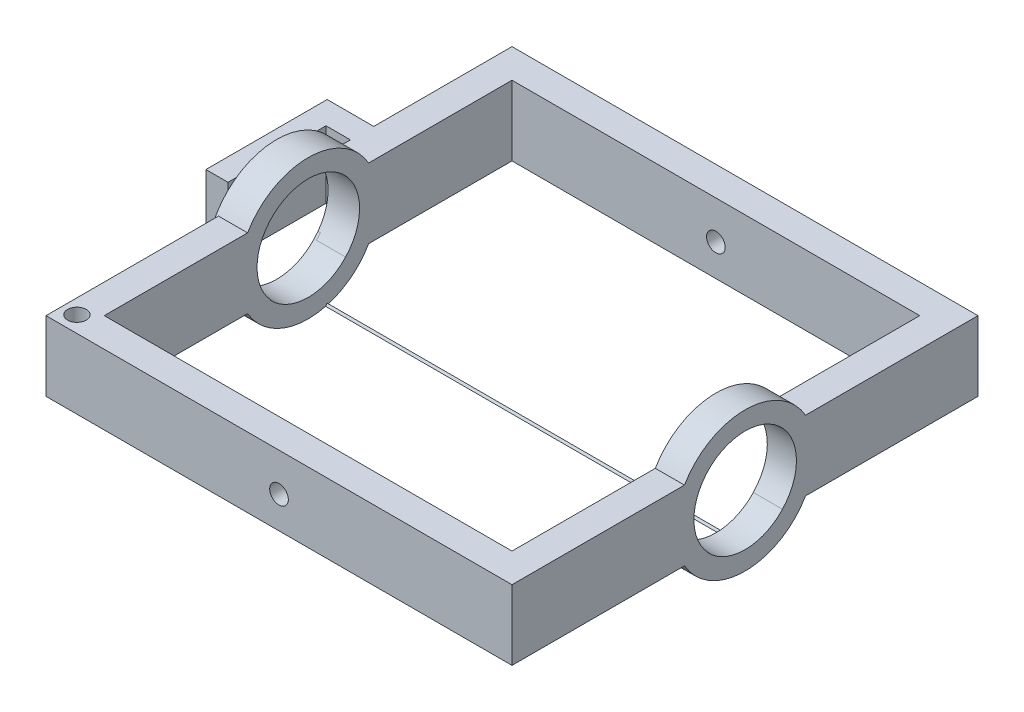
ISO-10303-21;
HEADER;
FILE_DESCRIPTION(('STEP AP214'),'2;1');
FILE_NAME('part.step','',(''),(''),'','','');
FILE_SCHEMA(('AUTOMOTIVE_DESIGN { 1 0 10303 214 1 1 1 1 }'));
ENDSEC;
DATA;
#1=APPLICATION_CONTEXT('core data for automotive mechanical design processes');
#2=APPLICATION_PROTOCOL_DEFINITION('international standard','automotive_design',2000,#1);
#3=PRODUCT_CONTEXT('',#1,'mechanical');
#4=PRODUCT('Part','Part','',(#3));
#5=PRODUCT_RELATED_PRODUCT_CATEGORY('part','',(#4));
#6=PRODUCT_DEFINITION_FORMATION('','',#4);
#7=PRODUCT_DEFINITION_CONTEXT('part definition',#1,'design');
#8=PRODUCT_DEFINITION('design','',#6,#7);
#9=PRODUCT_DEFINITION_SHAPE('','',#8);
#10=(LENGTH_UNIT() NAMED_UNIT(*) SI_UNIT(.MILLI.,.METRE.));
#11=(NAMED_UNIT(*) PLANE_ANGLE_UNIT() SI_UNIT($,.RADIAN.));
#12=(NAMED_UNIT(*) SI_UNIT($,.STERADIAN.) SOLID_ANGLE_UNIT());
#13=UNCERTAINTY_MEASURE_WITH_UNIT(LENGTH_MEASURE(1.E-05),#10,'distance_accuracy_value','');
#14=(GEOMETRIC_REPRESENTATION_CONTEXT(3) GLOBAL_UNCERTAINTY_ASSIGNED_CONTEXT((#13)) GLOBAL_UNIT_ASSIGNED_CONTEXT((#10,
#11,#12)) REPRESENTATION_CONTEXT('',''));
#15=CARTESIAN_POINT('',(0.,0.,0.));
#16=DIRECTION('',(0.,0.,1.));
#17=DIRECTION('',(1.,0.,0.));
#18=AXIS2_PLACEMENT_3D('',#15,#16,#17);
#19=CARTESIAN_POINT('',(-101.,15.,0.));
#20=DIRECTION('',(1.,0.,0.));
#21=DIRECTION('',(0.,0.,-1.));
#22=AXIS2_PLACEMENT_3D('',#19,#20,#21);
#23=CYLINDRICAL_SURFACE('',#22,30.);
#24=DIRECTION('',(1.,0.,0.));
#25=VECTOR('',#24,1.);
#26=CARTESIAN_POINT('',(-101.,30.,-25.9807621135332));
#27=LINE('',#26,#25);
#28=CARTESIAN_POINT('',(100.,30.,-25.9807621135332));
#29=VERTEX_POINT('',#28);
#30=CARTESIAN_POINT('',(87.5000000000002,30.,-25.9807621135332));
#31=VERTEX_POINT('',#30);
#32=EDGE_CURVE('E416',#29,#31,#27,.F.);
#33=ORIENTED_EDGE('',*,*,#32,.T.);
#34=CARTESIAN_POINT('',(87.5000000000002,15.,0.));
#35=DIRECTION('',(1.,0.,0.));
#36=DIRECTION('',(0.,0.,-1.));
#37=AXIS2_PLACEMENT_3D('',#34,#35,#36);
#38=CIRCLE('',#37,30.);
#39=CARTESIAN_POINT('',(87.5000000000002,30.,25.9807621135332));
#40=VERTEX_POINT('',#39);
#41=EDGE_CURVE('E294',#40,#31,#38,.F.);
#42=ORIENTED_EDGE('',*,*,#41,.F.);
#43=DIRECTION('',(1.,0.,0.));
#44=VECTOR('',#43,1.);
#45=CARTESIAN_POINT('',(-101.,30.,25.9807621135332));
#46=LINE('',#45,#44);
#47=CARTESIAN_POINT('',(100.,30.,25.9807621135331));
#48=VERTEX_POINT('',#47);
#49=EDGE_CURVE('E405',#40,#48,#46,.T.);
#50=ORIENTED_EDGE('',*,*,#49,.T.);
#51=CARTESIAN_POINT('',(100.,15.,0.));
#52=DIRECTION('',(1.,0.,0.));
#53=DIRECTION('',(0.,0.,-1.));
#54=AXIS2_PLACEMENT_3D('',#51,#52,#53);
#55=CIRCLE('',#54,30.);
#56=EDGE_CURVE('E381',#29,#48,#55,.T.);
#57=ORIENTED_EDGE('',*,*,#56,.F.);
#58=EDGE_LOOP('',(#33,#42,#50,#57));
#59=FACE_BOUND('',#58,.T.);
#60=ADVANCED_FACE('F34',(#59),#23,.T.);
#61=CARTESIAN_POINT('',(-101.,15.,0.));
#62=DIRECTION('',(1.,0.,0.));
#63=DIRECTION('',(0.,0.,-1.));
#64=AXIS2_PLACEMENT_3D('',#61,#62,#63);
#65=CYLINDRICAL_SURFACE('',#64,22.);
#66=CARTESIAN_POINT('',(-87.5,15.,0.));
#67=DIRECTION('',(1.,0.,0.));
#68=DIRECTION('',(0.,0.,-1.));
#69=AXIS2_PLACEMENT_3D('',#66,#67,#68);
#70=CIRCLE('',#69,22.);
#71=CARTESIAN_POINT('',(-87.5,0.,-16.0934769394311));
#72=VERTEX_POINT('',#71);
#73=CARTESIAN_POINT('',(-87.5,0.,16.0934769394311));
#74=VERTEX_POINT('',#73);
#75=EDGE_CURVE('E284',#72,#74,#70,.F.);
#76=ORIENTED_EDGE('',*,*,#75,.F.);
#77=DIRECTION('',(1.,0.,0.));
#78=VECTOR('',#77,1.);
#79=CARTESIAN_POINT('',(-101.,0.,-16.0934769394311));
#80=LINE('',#79,#78);
#81=CARTESIAN_POINT('',(-100.,0.,-16.0934769394311));
#82=VERTEX_POINT('',#81);
#83=EDGE_CURVE('E390',#72,#82,#80,.F.);
#84=ORIENTED_EDGE('',*,*,#83,.T.);
#85=CARTESIAN_POINT('',(-100.,15.,0.));
#86=DIRECTION('',(1.,0.,0.));
#87=DIRECTION('',(0.,0.,-1.));
#88=AXIS2_PLACEMENT_3D('',#85,#86,#87);
#89=CIRCLE('',#88,22.);
#90=CARTESIAN_POINT('',(-100.,1.98598373428147,-17.7379643881595));
#91=VERTEX_POINT('',#90);
#92=EDGE_CURVE('E393',#82,#91,#89,.T.);
#93=ORIENTED_EDGE('',*,*,#92,.T.);
#94=DIRECTION('',(1.,0.,0.));
#95=VECTOR('',#94,1.);
#96=CARTESIAN_POINT('',(-0.500000000000028,1.98598373428147,-17.7379643881595));
#97=LINE('',#96,#95);
#98=CARTESIAN_POINT('',(-101.,1.98598373428147,-17.7379643881595));
#99=VERTEX_POINT('',#98);
#100=EDGE_CURVE('E352',#91,#99,#97,.F.);
#101=ORIENTED_EDGE('',*,*,#100,.T.);
#102=CARTESIAN_POINT('',(-101.,15.,0.));
#103=DIRECTION('',(1.,0.,0.));
#104=DIRECTION('',(0.,0.,-1.));
#105=AXIS2_PLACEMENT_3D('',#102,#103,#104);
#106=CIRCLE('',#105,22.);
#107=CARTESIAN_POINT('',(-101.,28.1147890774808,17.6635870494413));
#108=VERTEX_POINT('',#107);
#109=EDGE_CURVE('E371',#108,#99,#106,.T.);
#110=ORIENTED_EDGE('',*,*,#109,.F.);
#111=DIRECTION('',(1.,0.,0.));
#112=VECTOR('',#111,1.);
#113=CARTESIAN_POINT('',(-0.500000000000028,28.1147890774808,17.6635870494413));
#114=LINE('',#113,#112);
#115=CARTESIAN_POINT('',(-100.,28.1147890774808,17.6635870494413));
#116=VERTEX_POINT('',#115);
#117=EDGE_CURVE('E362',#108,#116,#114,.T.);
#118=ORIENTED_EDGE('',*,*,#117,.T.);
#119=CARTESIAN_POINT('',(-100.,15.,0.));
#120=DIRECTION('',(1.,0.,0.));
#121=DIRECTION('',(0.,0.,-1.));
#122=AXIS2_PLACEMENT_3D('',#119,#120,#121);
#123=CIRCLE('',#122,22.);
#124=CARTESIAN_POINT('',(-100.,0.,16.0934769394311));
#125=VERTEX_POINT('',#124);
#126=EDGE_CURVE('E386',#116,#125,#123,.T.);
#127=ORIENTED_EDGE('',*,*,#126,.T.);
#128=DIRECTION('',(1.,0.,0.));
#129=VECTOR('',#128,1.);
#130=CARTESIAN_POINT('',(-101.,0.,16.0934769394311));
#131=LINE('',#130,#129);
#132=EDGE_CURVE('E380',#125,#74,#131,.T.);
#133=ORIENTED_EDGE('',*,*,#132,.T.);
#134=EDGE_LOOP('',(#76,#84,#93,#101,#110,#118,#127,#133));
#135=FACE_BOUND('',#134,.T.);
#136=ADVANCED_FACE('F648',(#135),#65,.F.);
#137=CARTESIAN_POINT('',(-101.,15.1007728117623,-0.0743773387182023));
#138=DIRECTION('',(1.,0.,0.));
#139=DIRECTION('',(0.,0.,-1.));
#140=AXIS2_PLACEMENT_3D('',#137,#138,#139);
#141=CYLINDRICAL_SURFACE('',#140,22.);
#142=DIRECTION('',(1.,0.,0.));
#143=VECTOR('',#142,1.);
#144=CARTESIAN_POINT('',(-101.,0.,-16.0733354450306));
#145=LINE('',#144,#143);
#146=CARTESIAN_POINT('',(-87.5,0.,-16.0733354450306));
#147=VERTEX_POINT('',#146);
#148=CARTESIAN_POINT('',(-100.,0.,-16.0733354450306));
#149=VERTEX_POINT('',#148);
#150=EDGE_CURVE('E347',#147,#149,#145,.F.);
#151=ORIENTED_EDGE('',*,*,#150,.F.);
#152=CARTESIAN_POINT('',(-87.5,15.1007728117623,-0.0743773387182023));
#153=DIRECTION('',(-1.,0.,0.));
#154=DIRECTION('',(0.,0.,1.));
#155=AXIS2_PLACEMENT_3D('',#152,#153,#154);
#156=CIRCLE('',#155,22.);
#157=CARTESIAN_POINT('',(-87.5,0.,15.9245807675942));
#158=VERTEX_POINT('',#157);
#159=EDGE_CURVE('E351',#158,#147,#156,.T.);
#160=ORIENTED_EDGE('',*,*,#159,.F.);
#161=DIRECTION('',(1.,0.,0.));
#162=VECTOR('',#161,1.);
#163=CARTESIAN_POINT('',(-101.,0.,15.9245807675942));
#164=LINE('',#163,#162);
#165=CARTESIAN_POINT('',(-100.,0.,15.9245807675942));
#166=VERTEX_POINT('',#165);
#167=EDGE_CURVE('E357',#166,#158,#164,.T.);
#168=ORIENTED_EDGE('',*,*,#167,.F.);
#169=CARTESIAN_POINT('',(-100.,15.1007728117623,-0.0743773387182023));
#170=DIRECTION('',(1.,0.,0.));
#171=DIRECTION('',(0.,0.,-1.));
#172=AXIS2_PLACEMENT_3D('',#169,#170,#171);
#173=CIRCLE('',#172,22.);
#174=EDGE_CURVE('E366',#116,#166,#173,.T.);
#175=ORIENTED_EDGE('',*,*,#174,.F.);
#176=ORIENTED_EDGE('',*,*,#117,.F.);
#177=CARTESIAN_POINT('',(-101.,15.1007728117623,-0.0743773387182023));
#178=DIRECTION('',(1.,0.,0.));
#179=DIRECTION('',(0.,0.,-1.));
#180=AXIS2_PLACEMENT_3D('',#177,#178,#179);
#181=CIRCLE('',#180,22.);
#182=EDGE_CURVE('E344',#99,#108,#181,.T.);
#183=ORIENTED_EDGE('',*,*,#182,.F.);
#184=ORIENTED_EDGE('',*,*,#100,.F.);
#185=CARTESIAN_POINT('',(-100.,15.1007728117623,-0.0743773387182023));
#186=DIRECTION('',(1.,0.,0.));
#187=DIRECTION('',(0.,0.,-1.));
#188=AXIS2_PLACEMENT_3D('',#185,#186,#187);
#189=CIRCLE('',#188,22.);
#190=EDGE_CURVE('E355',#149,#91,#189,.T.);
#191=ORIENTED_EDGE('',*,*,#190,.F.);
#192=EDGE_LOOP('',(#151,#160,#168,#175,#176,#183,#184,#191));
#193=FACE_BOUND('',#192,.T.);
#194=ADVANCED_FACE('F657',(#193),#141,.F.);
#195=CARTESIAN_POINT('',(87.5000000000002,15.3761332783802,31.9163524114279));
#196=DIRECTION('',(-1.,0.,0.));
#197=DIRECTION('',(0.,0.,1.));
#198=AXIS2_PLACEMENT_3D('',#195,#196,#197);
#199=CYLINDRICAL_SURFACE('',#198,49.1927831016251);
#200=CARTESIAN_POINT('',(87.5000000000002,15.3761332783802,31.9163524114279));
#201=DIRECTION('',(1.,0.,0.));
#202=DIRECTION('',(0.,0.,-1.));
#203=AXIS2_PLACEMENT_3D('',#200,#201,#202);
#204=CIRCLE('',#203,49.1927831016251);
#205=CARTESIAN_POINT('',(87.5000000000002,-14.0451900440909,-7.50845758479339));
#206=VERTEX_POINT('',#205);
#207=CARTESIAN_POINT('',(87.5000000000002,-13.164393734876,-8.15069423652366));
#208=VERTEX_POINT('',#207);
#209=EDGE_CURVE('E278',#206,#208,#204,.T.);
#210=ORIENTED_EDGE('',*,*,#209,.T.);
#211=DIRECTION('',(-1.,0.,0.));
#212=VECTOR('',#211,1.);
#213=CARTESIAN_POINT('',(0.,-13.164393734876,-8.15069423652365));
#214=LINE('',#213,#212);
#215=CARTESIAN_POINT('',(-87.5,-13.164393734876,-8.15069423652366));
#216=VERTEX_POINT('',#215);
#217=EDGE_CURVE('E11',#208,#216,#214,.T.);
#218=ORIENTED_EDGE('',*,*,#217,.T.);
#219=CARTESIAN_POINT('',(-87.5,15.3761332783802,31.9163524114279));
#220=DIRECTION('',(1.,0.,0.));
#221=DIRECTION('',(0.,0.,-1.));
#222=AXIS2_PLACEMENT_3D('',#219,#220,#221);
#223=CIRCLE('',#222,49.1927831016251);
#224=CARTESIAN_POINT('',(-87.5,-14.0451900440909,-7.50845758479339));
#225=VERTEX_POINT('',#224);
#226=EDGE_CURVE('E275',#225,#216,#223,.T.);
#227=ORIENTED_EDGE('',*,*,#226,.F.);
#228=DIRECTION('',(-1.,0.,0.));
#229=VECTOR('',#228,1.);
#230=CARTESIAN_POINT('',(0.,-14.0451900440909,-7.50845758479339));
#231=LINE('',#230,#229);
#232=EDGE_CURVE('E298',#206,#225,#231,.T.);
#233=ORIENTED_EDGE('',*,*,#232,.F.);
#234=EDGE_LOOP('',(#210,#218,#227,#233));
#235=FACE_BOUND('',#234,.T.);
#236=ADVANCED_FACE('F274',(#235),#199,.F.);
#237=CARTESIAN_POINT('',(-100.,30.,-100.));
#238=DIRECTION('',(1.,0.,0.));
#239=DIRECTION('',(0.,0.,-1.));
#240=AXIS2_PLACEMENT_3D('',#237,#238,#239);
#241=PLANE('',#240);
#242=DIRECTION('',(0.,-1.,0.));
#243=VECTOR('',#242,1.);
#244=CARTESIAN_POINT('',(-100.,30.,-40.6668274564764));
#245=LINE('',#244,#243);
#246=CARTESIAN_POINT('',(-100.,30.,-40.6668274564764));
#247=VERTEX_POINT('',#246);
#248=CARTESIAN_POINT('',(-100.,1.14409561425077,-40.6668274564764));
#249=VERTEX_POINT('',#248);
#250=EDGE_CURVE('E341',#247,#249,#245,.T.);
#251=ORIENTED_EDGE('',*,*,#250,.F.);
#252=DIRECTION('',(0.,0.,1.));
#253=VECTOR('',#252,1.);
#254=CARTESIAN_POINT('',(-100.,30.,-100.));
#255=LINE('',#254,#253);
#256=CARTESIAN_POINT('',(-100.,30.,-100.));
#257=VERTEX_POINT('',#256);
#258=EDGE_CURVE('E477',#257,#247,#255,.T.);
#259=ORIENTED_EDGE('',*,*,#258,.F.);
#260=DIRECTION('',(0.,-1.,0.));
#261=VECTOR('',#260,1.);
#262=CARTESIAN_POINT('',(-100.,30.,-100.));
#263=LINE('',#262,#261);
#264=CARTESIAN_POINT('',(-100.,0.,-100.));
#265=VERTEX_POINT('',#264);
#266=EDGE_CURVE('E503',#257,#265,#263,.T.);
#267=ORIENTED_EDGE('',*,*,#266,.T.);
#268=DIRECTION('',(0.,0.,1.));
#269=VECTOR('',#268,1.);
#270=CARTESIAN_POINT('',(-100.,0.,-100.));
#271=LINE('',#270,#269);
#272=CARTESIAN_POINT('',(-100.,0.,-25.9807621135332));
#273=VERTEX_POINT('',#272);
#274=EDGE_CURVE('E491',#265,#273,#271,.T.);
#275=ORIENTED_EDGE('',*,*,#274,.T.);
#276=CARTESIAN_POINT('',(-100.,15.,0.));
#277=DIRECTION('',(1.,0.,0.));
#278=DIRECTION('',(0.,0.,-1.));
#279=AXIS2_PLACEMENT_3D('',#276,#277,#278);
#280=CIRCLE('',#279,30.);
#281=CARTESIAN_POINT('',(-100.,30.,-25.9807621135332));
#282=VERTEX_POINT('',#281);
#283=EDGE_CURVE('E415',#273,#282,#280,.T.);
#284=ORIENTED_EDGE('',*,*,#283,.T.);
#285=CARTESIAN_POINT('',(-100.,30.,-30.6579049439222));
#286=VERTEX_POINT('',#285);
#287=EDGE_CURVE('E55',#286,#282,#255,.T.);
#288=ORIENTED_EDGE('',*,*,#287,.F.);
#289=DIRECTION('',(0.,1.,0.));
#290=VECTOR('',#289,1.);
#291=CARTESIAN_POINT('',(-100.,30.,-30.6579049439222));
#292=LINE('',#291,#290);
#293=CARTESIAN_POINT('',(-100.,1.14409561425077,-30.6579049439222));
#294=VERTEX_POINT('',#293);
#295=EDGE_CURVE('E339',#294,#286,#292,.T.);
#296=ORIENTED_EDGE('',*,*,#295,.F.);
#297=DIRECTION('',(0.,0.,1.));
#298=VECTOR('',#297,1.);
#299=CARTESIAN_POINT('',(-100.,1.14409561425077,-100.));
#300=LINE('',#299,#298);
#301=EDGE_CURVE('E49',#249,#294,#300,.T.);
#302=ORIENTED_EDGE('',*,*,#301,.F.);
#303=EDGE_LOOP('',(#251,#259,#267,#275,#284,#288,#296,#302));
#304=FACE_BOUND('',#303,.T.);
#305=ADVANCED_FACE('F542',(#304),#241,.F.);
#306=CARTESIAN_POINT('',(0.,13.6147395955971,-150.5));
#307=DIRECTION('',(0.,0.,1.));
#308=DIRECTION('',(1.,0.,0.));
#309=AXIS2_PLACEMENT_3D('',#306,#307,#308);
#310=CYLINDRICAL_SURFACE('',#309,4.);
#311=CARTESIAN_POINT('',(0.,13.6147395955971,100.));
#312=DIRECTION('',(0.,0.,1.));
#313=DIRECTION('',(1.,0.,0.));
#314=AXIS2_PLACEMENT_3D('',#311,#312,#313);
#315=CIRCLE('',#314,4.);
#316=CARTESIAN_POINT('',(4.,13.6147395955971,100.));
#317=VERTEX_POINT('',#316);
#318=EDGE_CURVE('E418',#317,#317,#315,.T.);
#319=ORIENTED_EDGE('',*,*,#318,.T.);
#320=EDGE_LOOP('',(#319));
#321=FACE_BOUND('',#320,.T.);
#322=CARTESIAN_POINT('',(0.,13.6147395955971,87.5));
#323=DIRECTION('',(0.,0.,1.));
#324=DIRECTION('',(1.,0.,0.));
#325=AXIS2_PLACEMENT_3D('',#322,#323,#324);
#326=CIRCLE('',#325,4.);
#327=CARTESIAN_POINT('',(4.,13.6147395955971,87.5));
#328=VERTEX_POINT('',#327);
#329=EDGE_CURVE('E422',#328,#328,#326,.T.);
#330=ORIENTED_EDGE('',*,*,#329,.F.);
#331=EDGE_LOOP('',(#330));
#332=FACE_BOUND('',#331,.T.);
#333=ADVANCED_FACE('F737',(#321,#332),#310,.F.);
#334=CARTESIAN_POINT('',(0.,13.6147395955971,-87.5));
#335=DIRECTION('',(0.,0.,-1.));
#336=DIRECTION('',(-1.,0.,0.));
#337=AXIS2_PLACEMENT_3D('',#334,#335,#336);
#338=CIRCLE('',#337,4.);
#339=CARTESIAN_POINT('',(-4.,13.6147395955971,-87.5));
#340=VERTEX_POINT('',#339);
#341=EDGE_CURVE('E421',#340,#340,#338,.T.);
#342=ORIENTED_EDGE('',*,*,#341,.F.);
#343=EDGE_LOOP('',(#342));
#344=FACE_BOUND('',#343,.T.);
#345=CARTESIAN_POINT('',(0.,13.6147395955971,-100.));
#346=DIRECTION('',(0.,0.,1.));
#347=DIRECTION('',(1.,0.,0.));
#348=AXIS2_PLACEMENT_3D('',#345,#346,#347);
#349=CIRCLE('',#348,4.);
#350=CARTESIAN_POINT('',(4.,13.6147395955971,-100.));
#351=VERTEX_POINT('',#350);
#352=EDGE_CURVE('E425',#351,#351,#349,.T.);
#353=ORIENTED_EDGE('',*,*,#352,.F.);
#354=EDGE_LOOP('',(#353));
#355=FACE_BOUND('',#354,.T.);
#356=ADVANCED_FACE('F935',(#344,#355),#310,.F.);
#357=CARTESIAN_POINT('',(-87.5,0.,-87.5));
#358=DIRECTION('',(0.,0.,-1.));
#359=DIRECTION('',(-1.,0.,0.));
#360=AXIS2_PLACEMENT_3D('',#357,#358,#359);
#361=PLANE('',#360);
#362=ORIENTED_EDGE('',*,*,#341,.T.);
#363=EDGE_LOOP('',(#362));
#364=FACE_BOUND('',#363,.T.);
#365=DIRECTION('',(-1.,0.,0.));
#366=VECTOR('',#365,1.);
#367=CARTESIAN_POINT('',(-87.5,30.,-87.5));
#368=LINE('',#367,#366);
#369=CARTESIAN_POINT('',(87.5,30.,-87.5));
#370=VERTEX_POINT('',#369);
#371=CARTESIAN_POINT('',(-87.5,30.,-87.5));
#372=VERTEX_POINT('',#371);
#373=EDGE_CURVE('E450',#370,#372,#368,.T.);
#374=ORIENTED_EDGE('',*,*,#373,.T.);
#375=DIRECTION('',(0.,1.,0.));
#376=VECTOR('',#375,1.);
#377=CARTESIAN_POINT('',(-87.5,0.,-87.5));
#378=LINE('',#377,#376);
#379=CARTESIAN_POINT('',(-87.5,0.,-87.5));
#380=VERTEX_POINT('',#379);
#381=EDGE_CURVE('E467',#380,#372,#378,.T.);
#382=ORIENTED_EDGE('',*,*,#381,.F.);
#383=DIRECTION('',(-1.,0.,0.));
#384=VECTOR('',#383,1.);
#385=CARTESIAN_POINT('',(-87.5,0.,-87.5));
#386=LINE('',#385,#384);
#387=CARTESIAN_POINT('',(87.5,0.,-87.5));
#388=VERTEX_POINT('',#387);
#389=EDGE_CURVE('E434',#388,#380,#386,.T.);
#390=ORIENTED_EDGE('',*,*,#389,.F.);
#391=DIRECTION('',(0.,1.,0.));
#392=VECTOR('',#391,1.);
#393=CARTESIAN_POINT('',(87.5,0.,-87.5));
#394=LINE('',#393,#392);
#395=EDGE_CURVE('E447',#388,#370,#394,.T.);
#396=ORIENTED_EDGE('',*,*,#395,.T.);
#397=EDGE_LOOP('',(#374,#382,#390,#396));
#398=FACE_BOUND('',#397,.T.);
#399=ADVANCED_FACE('F637',(#364,#398),#361,.F.);
#400=CARTESIAN_POINT('',(87.5,0.,87.5));
#401=DIRECTION('',(1.,0.,0.));
#402=DIRECTION('',(0.,0.,-1.));
#403=AXIS2_PLACEMENT_3D('',#400,#401,#402);
#404=PLANE('',#403);
#405=ORIENTED_EDGE('',*,*,#395,.F.);
#406=DIRECTION('',(0.,0.,-1.));
#407=VECTOR('',#406,1.);
#408=CARTESIAN_POINT('',(87.5,0.,87.5));
#409=LINE('',#408,#407);
#410=CARTESIAN_POINT('',(87.5000000000002,0.,-25.9807621135332));
#411=VERTEX_POINT('',#410);
#412=EDGE_CURVE('E460',#411,#388,#409,.T.);
#413=ORIENTED_EDGE('',*,*,#412,.F.);
#414=CARTESIAN_POINT('',(87.5000000000002,15.,0.));
#415=DIRECTION('',(1.,0.,0.));
#416=DIRECTION('',(0.,0.,-1.));
#417=AXIS2_PLACEMENT_3D('',#414,#415,#416);
#418=CIRCLE('',#417,30.);
#419=CARTESIAN_POINT('',(87.5000000000002,-13.7132471437681,-8.6919179966734));
#420=VERTEX_POINT('',#419);
#421=EDGE_CURVE('E286',#411,#420,#418,.F.);
#422=ORIENTED_EDGE('',*,*,#421,.T.);
#423=CARTESIAN_POINT('',(87.5000000000002,15.4944351837685,-37.7624347741516));
#424=DIRECTION('',(1.,0.,0.));
#425=DIRECTION('',(0.,0.,-1.));
#426=AXIS2_PLACEMENT_3D('',#423,#424,#425);
#427=CIRCLE('',#426,41.2090239226305);
#428=EDGE_CURVE('E269',#208,#420,#427,.T.);
#429=ORIENTED_EDGE('',*,*,#428,.F.);
#430=ORIENTED_EDGE('',*,*,#209,.F.);
#431=CARTESIAN_POINT('',(87.5000000000002,0.,25.9807621135331));
#432=VERTEX_POINT('',#431);
#433=EDGE_CURVE('E295',#206,#432,#38,.F.);
#434=ORIENTED_EDGE('',*,*,#433,.T.);
#435=CARTESIAN_POINT('',(87.5,0.,87.5));
#436=VERTEX_POINT('',#435);
#437=EDGE_CURVE('E432',#436,#432,#409,.T.);
#438=ORIENTED_EDGE('',*,*,#437,.F.);
#439=DIRECTION('',(0.,1.,0.));
#440=VECTOR('',#439,1.);
#441=CARTESIAN_POINT('',(87.5,0.,87.5));
#442=LINE('',#441,#440);
#443=CARTESIAN_POINT('',(87.5,30.,87.5));
#444=VERTEX_POINT('',#443);
#445=EDGE_CURVE('E461',#436,#444,#442,.T.);
#446=ORIENTED_EDGE('',*,*,#445,.T.);
#447=DIRECTION('',(0.,0.,-1.));
#448=VECTOR('',#447,1.);
#449=CARTESIAN_POINT('',(87.5,30.,87.5));
#450=LINE('',#449,#448);
#451=EDGE_CURVE('E448',#444,#40,#450,.T.);
#452=ORIENTED_EDGE('',*,*,#451,.T.);
#453=ORIENTED_EDGE('',*,*,#41,.T.);
#454=EDGE_CURVE('E451',#31,#370,#450,.T.);
#455=ORIENTED_EDGE('',*,*,#454,.T.);
#456=EDGE_LOOP('',(#405,#413,#422,#429,#430,#434,#438,#446,#452,#453,#455));
#457=FACE_BOUND('',#456,.T.);
#458=CARTESIAN_POINT('',(87.5000000000002,0.,16.0934769394311));
#459=VERTEX_POINT('',#458);
#460=CARTESIAN_POINT('',(87.5,0.,15.9245807675942));
#461=VERTEX_POINT('',#460);
#462=EDGE_CURVE('E435',#459,#461,#409,.T.);
#463=ORIENTED_EDGE('',*,*,#462,.F.);
#464=CARTESIAN_POINT('',(87.5000000000002,15.,0.));
#465=DIRECTION('',(1.,0.,0.));
#466=DIRECTION('',(0.,0.,-1.));
#467=AXIS2_PLACEMENT_3D('',#464,#465,#466);
#468=CIRCLE('',#467,22.);
#469=CARTESIAN_POINT('',(87.5000000000002,0.,-16.0934769394311));
#470=VERTEX_POINT('',#469);
#471=EDGE_CURVE('E292',#470,#459,#468,.F.);
#472=ORIENTED_EDGE('',*,*,#471,.F.);
#473=CARTESIAN_POINT('',(87.5,0.,-16.0733354450306));
#474=VERTEX_POINT('',#473);
#475=EDGE_CURVE('E436',#474,#470,#409,.T.);
#476=ORIENTED_EDGE('',*,*,#475,.F.);
#477=CARTESIAN_POINT('',(87.5,15.1007728117623,-0.0743773387182023));
#478=DIRECTION('',(1.,0.,0.));
#479=DIRECTION('',(0.,0.,-1.));
#480=AXIS2_PLACEMENT_3D('',#477,#478,#479);
#481=CIRCLE('',#480,22.);
#482=EDGE_CURVE('E349',#474,#461,#481,.T.);
#483=ORIENTED_EDGE('',*,*,#482,.T.);
#484=EDGE_LOOP('',(#463,#472,#476,#483));
#485=FACE_BOUND('',#484,.T.);
#486=ADVANCED_FACE('F601',(#457,#485),#404,.F.);
#487=CARTESIAN_POINT('',(-87.5,0.,87.5));
#488=DIRECTION('',(0.,0.,1.));
#489=DIRECTION('',(1.,0.,0.));
#490=AXIS2_PLACEMENT_3D('',#487,#488,#489);
#491=PLANE('',#490);
#492=ORIENTED_EDGE('',*,*,#329,.T.);
#493=EDGE_LOOP('',(#492));
#494=FACE_BOUND('',#493,.T.);
#495=DIRECTION('',(1.,0.,0.));
#496=VECTOR('',#495,1.);
#497=CARTESIAN_POINT('',(-87.5,30.,87.5));
#498=LINE('',#497,#496);
#499=CARTESIAN_POINT('',(-87.5,30.,87.5));
#500=VERTEX_POINT('',#499);
#501=EDGE_CURVE('E457',#500,#444,#498,.T.);
#502=ORIENTED_EDGE('',*,*,#501,.T.);
#503=ORIENTED_EDGE('',*,*,#445,.F.);
#504=DIRECTION('',(1.,0.,0.));
#505=VECTOR('',#504,1.);
#506=CARTESIAN_POINT('',(-87.5,0.,87.5));
#507=LINE('',#506,#505);
#508=CARTESIAN_POINT('',(-87.5,0.,87.5));
#509=VERTEX_POINT('',#508);
#510=EDGE_CURVE('E442',#509,#436,#507,.T.);
#511=ORIENTED_EDGE('',*,*,#510,.F.);
#512=DIRECTION('',(0.,1.,0.));
#513=VECTOR('',#512,1.);
#514=CARTESIAN_POINT('',(-87.5,0.,87.5));
#515=LINE('',#514,#513);
#516=EDGE_CURVE('E464',#509,#500,#515,.T.);
#517=ORIENTED_EDGE('',*,*,#516,.T.);
#518=EDGE_LOOP('',(#502,#503,#511,#517));
#519=FACE_BOUND('',#518,.T.);
#520=ADVANCED_FACE('F632',(#494,#519),#491,.F.);
#521=CARTESIAN_POINT('',(-87.5,0.,87.5));
#522=DIRECTION('',(-1.,0.,0.));
#523=DIRECTION('',(0.,0.,1.));
#524=AXIS2_PLACEMENT_3D('',#521,#522,#523);
#525=PLANE('',#524);
#526=ORIENTED_EDGE('',*,*,#226,.T.);
#527=CARTESIAN_POINT('',(-87.5,15.4944351837685,-37.7624347741516));
#528=DIRECTION('',(1.,0.,0.));
#529=DIRECTION('',(0.,0.,-1.));
#530=AXIS2_PLACEMENT_3D('',#527,#528,#529);
#531=CIRCLE('',#530,41.2090239226305);
#532=CARTESIAN_POINT('',(-87.5,-13.7132471437681,-8.6919179966734));
#533=VERTEX_POINT('',#532);
#534=EDGE_CURVE('E259',#216,#533,#531,.T.);
#535=ORIENTED_EDGE('',*,*,#534,.T.);
#536=CARTESIAN_POINT('',(-87.5,15.,0.));
#537=DIRECTION('',(1.,0.,0.));
#538=DIRECTION('',(0.,0.,-1.));
#539=AXIS2_PLACEMENT_3D('',#536,#537,#538);
#540=CIRCLE('',#539,30.);
#541=CARTESIAN_POINT('',(-87.5,0.,-25.9807621135332));
#542=VERTEX_POINT('',#541);
#543=EDGE_CURVE('E561',#542,#533,#540,.F.);
#544=ORIENTED_EDGE('',*,*,#543,.F.);
#545=DIRECTION('',(0.,0.,1.));
#546=VECTOR('',#545,1.);
#547=CARTESIAN_POINT('',(-87.5,0.,87.5));
#548=LINE('',#547,#546);
#549=EDGE_CURVE('E440',#380,#542,#548,.T.);
#550=ORIENTED_EDGE('',*,*,#549,.F.);
#551=ORIENTED_EDGE('',*,*,#381,.T.);
#552=DIRECTION('',(0.,0.,1.));
#553=VECTOR('',#552,1.);
#554=CARTESIAN_POINT('',(-87.5,30.,87.5));
#555=LINE('',#554,#553);
#556=CARTESIAN_POINT('',(-87.5,30.,-25.9807621135332));
#557=VERTEX_POINT('',#556);
#558=EDGE_CURVE('E455',#372,#557,#555,.T.);
#559=ORIENTED_EDGE('',*,*,#558,.T.);
#560=CARTESIAN_POINT('',(-87.5,15.,0.));
#561=DIRECTION('',(1.,0.,0.));
#562=DIRECTION('',(0.,0.,-1.));
#563=AXIS2_PLACEMENT_3D('',#560,#561,#562);
#564=CIRCLE('',#563,30.);
#565=CARTESIAN_POINT('',(-87.5,30.,25.9807621135332));
#566=VERTEX_POINT('',#565);
#567=EDGE_CURVE('E290',#566,#557,#564,.F.);
#568=ORIENTED_EDGE('',*,*,#567,.F.);
#569=EDGE_CURVE('E454',#566,#500,#555,.T.);
#570=ORIENTED_EDGE('',*,*,#569,.T.);
#571=ORIENTED_EDGE('',*,*,#516,.F.);
#572=CARTESIAN_POINT('',(-87.5,0.,25.9807621135331));
#573=VERTEX_POINT('',#572);
#574=EDGE_CURVE('E439',#573,#509,#548,.T.);
#575=ORIENTED_EDGE('',*,*,#574,.F.);
#576=EDGE_CURVE('E282',#225,#573,#564,.F.);
#577=ORIENTED_EDGE('',*,*,#576,.F.);
#578=EDGE_LOOP('',(#526,#535,#544,#550,#551,#559,#568,#570,#571,#575,#577));
#579=FACE_BOUND('',#578,.T.);
#580=ORIENTED_EDGE('',*,*,#75,.T.);
#581=EDGE_CURVE('E444',#158,#74,#548,.T.);
#582=ORIENTED_EDGE('',*,*,#581,.F.);
#583=ORIENTED_EDGE('',*,*,#159,.T.);
#584=EDGE_CURVE('E443',#72,#147,#548,.T.);
#585=ORIENTED_EDGE('',*,*,#584,.F.);
#586=EDGE_LOOP('',(#580,#582,#583,#585));
#587=FACE_BOUND('',#586,.T.);
#588=ADVANCED_FACE('F279',(#579,#587),#525,.F.);
#589=CARTESIAN_POINT('',(-100.,30.,25.9807621135332));
#590=VERTEX_POINT('',#589);
#591=CARTESIAN_POINT('',(-100.,30.,100.));
#592=VERTEX_POINT('',#591);
#593=EDGE_CURVE('E476',#590,#592,#255,.T.);
#594=ORIENTED_EDGE('',*,*,#593,.F.);
#595=CARTESIAN_POINT('',(-100.,15.,0.));
#596=DIRECTION('',(1.,0.,0.));
#597=DIRECTION('',(0.,0.,-1.));
#598=AXIS2_PLACEMENT_3D('',#595,#596,#597);
#599=CIRCLE('',#598,30.);
#600=CARTESIAN_POINT('',(-100.,0.,25.9807621135332));
#601=VERTEX_POINT('',#600);
#602=EDGE_CURVE('E404',#590,#601,#599,.T.);
#603=ORIENTED_EDGE('',*,*,#602,.T.);
#604=CARTESIAN_POINT('',(-100.,0.,100.));
#605=VERTEX_POINT('',#604);
#606=EDGE_CURVE('E490',#601,#605,#271,.T.);
#607=ORIENTED_EDGE('',*,*,#606,.T.);
#608=DIRECTION('',(0.,-1.,0.));
#609=VECTOR('',#608,1.);
#610=CARTESIAN_POINT('',(-100.,30.,100.));
#611=LINE('',#610,#609);
#612=EDGE_CURVE('E500',#592,#605,#611,.T.);
#613=ORIENTED_EDGE('',*,*,#612,.F.);
#614=EDGE_LOOP('',(#594,#603,#607,#613));
#615=FACE_BOUND('',#614,.T.);
#616=ADVANCED_FACE('F576',(#615),#241,.F.);
#617=CARTESIAN_POINT('',(-93.6945215497768,-201.,93.0455013493783));
#618=DIRECTION('',(0.,1.,0.));
#619=DIRECTION('',(0.,0.,1.));
#620=AXIS2_PLACEMENT_3D('',#617,#618,#619);
#621=CYLINDRICAL_SURFACE('',#620,4.00000000000001);
#622=CARTESIAN_POINT('',(-93.6945215497768,30.,93.0455013493783));
#623=DIRECTION('',(0.,1.,0.));
#624=DIRECTION('',(0.,0.,1.));
#625=AXIS2_PLACEMENT_3D('',#622,#623,#624);
#626=CIRCLE('',#625,4.00000000000001);
#627=CARTESIAN_POINT('',(-93.6945215497768,30.,97.0455013493783));
#628=VERTEX_POINT('',#627);
#629=EDGE_CURVE('E428',#628,#628,#626,.T.);
#630=ORIENTED_EDGE('',*,*,#629,.T.);
#631=EDGE_LOOP('',(#630));
#632=FACE_BOUND('',#631,.T.);
#633=CARTESIAN_POINT('',(-93.6945215497768,0.,93.0455013493783));
#634=DIRECTION('',(0.,1.,0.));
#635=DIRECTION('',(0.,0.,1.));
#636=AXIS2_PLACEMENT_3D('',#633,#634,#635);
#637=CIRCLE('',#636,4.00000000000001);
#638=CARTESIAN_POINT('',(-93.6945215497768,0.,97.0455013493783));
#639=VERTEX_POINT('',#638);
#640=EDGE_CURVE('E431',#639,#639,#637,.T.);
#641=ORIENTED_EDGE('',*,*,#640,.F.);
#642=EDGE_LOOP('',(#641));
#643=FACE_BOUND('',#642,.T.);
#644=ADVANCED_FACE('F967',(#632,#643),#621,.F.);
#645=CARTESIAN_POINT('',(-100.,30.,100.));
#646=DIRECTION('',(0.,0.,-1.));
#647=DIRECTION('',(-1.,0.,0.));
#648=AXIS2_PLACEMENT_3D('',#645,#646,#647);
#649=PLANE('',#648);
#650=ORIENTED_EDGE('',*,*,#318,.F.);
#651=EDGE_LOOP('',(#650));
#652=FACE_BOUND('',#651,.T.);
#653=DIRECTION('',(1.,0.,0.));
#654=VECTOR('',#653,1.);
#655=CARTESIAN_POINT('',(-100.,0.,100.));
#656=LINE('',#655,#654);
#657=CARTESIAN_POINT('',(100.,0.,100.));
#658=VERTEX_POINT('',#657);
#659=EDGE_CURVE('E494',#605,#658,#656,.T.);
#660=ORIENTED_EDGE('',*,*,#659,.T.);
#661=DIRECTION('',(0.,-1.,0.));
#662=VECTOR('',#661,1.);
#663=CARTESIAN_POINT('',(100.,30.,100.));
#664=LINE('',#663,#662);
#665=CARTESIAN_POINT('',(100.,30.,100.));
#666=VERTEX_POINT('',#665);
#667=EDGE_CURVE('E482',#666,#658,#664,.T.);
#668=ORIENTED_EDGE('',*,*,#667,.F.);
#669=DIRECTION('',(1.,0.,0.));
#670=VECTOR('',#669,1.);
#671=CARTESIAN_POINT('',(-100.,30.,100.));
#672=LINE('',#671,#670);
#673=EDGE_CURVE('E480',#592,#666,#672,.T.);
#674=ORIENTED_EDGE('',*,*,#673,.F.);
#675=ORIENTED_EDGE('',*,*,#612,.T.);
#676=EDGE_LOOP('',(#660,#668,#674,#675));
#677=FACE_BOUND('',#676,.T.);
#678=ADVANCED_FACE('F580',(#652,#677),#649,.F.);
#679=CARTESIAN_POINT('',(0.,30.,0.));
#680=DIRECTION('',(0.,1.,0.));
#681=DIRECTION('',(0.,0.,1.));
#682=AXIS2_PLACEMENT_3D('',#679,#680,#681);
#683=PLANE('',#682);
#684=EDGE_CURVE('E400',#590,#566,#46,.T.);
#685=ORIENTED_EDGE('',*,*,#684,.F.);
#686=ORIENTED_EDGE('',*,*,#593,.T.);
#687=ORIENTED_EDGE('',*,*,#673,.T.);
#688=DIRECTION('',(0.,0.,-1.));
#689=VECTOR('',#688,1.);
#690=CARTESIAN_POINT('',(100.,30.,-100.));
#691=LINE('',#690,#689);
#692=EDGE_CURVE('E471',#666,#48,#691,.T.);
#693=ORIENTED_EDGE('',*,*,#692,.T.);
#694=ORIENTED_EDGE('',*,*,#49,.F.);
#695=ORIENTED_EDGE('',*,*,#451,.F.);
#696=ORIENTED_EDGE('',*,*,#501,.F.);
#697=ORIENTED_EDGE('',*,*,#569,.F.);
#698=EDGE_LOOP('',(#685,#686,#687,#693,#694,#695,#696,#697));
#699=FACE_BOUND('',#698,.T.);
#700=ORIENTED_EDGE('',*,*,#629,.F.);
#701=EDGE_LOOP('',(#700));
#702=FACE_BOUND('',#701,.T.);
#703=ADVANCED_FACE('F570',(#699,#702),#683,.T.);
#704=DIRECTION('',(-1.,0.,0.));
#705=VECTOR('',#704,1.);
#706=CARTESIAN_POINT('',(-120.,30.,11.3734027973912));
#707=LINE('',#706,#705);
#708=CARTESIAN_POINT('',(-110.5,30.,11.3734027973912));
#709=VERTEX_POINT('',#708);
#710=CARTESIAN_POINT('',(-120.,30.,11.3734027973912));
#711=VERTEX_POINT('',#710);
#712=EDGE_CURVE('E319',#709,#711,#707,.T.);
#713=ORIENTED_EDGE('',*,*,#712,.F.);
#714=DIRECTION('',(0.,0.,1.));
#715=VECTOR('',#714,1.);
#716=CARTESIAN_POINT('',(-110.5,30.,-40.6668274564764));
#717=LINE('',#716,#715);
#718=CARTESIAN_POINT('',(-110.5,30.,-30.6579049439222));
#719=VERTEX_POINT('',#718);
#720=EDGE_CURVE('E313',#719,#709,#717,.T.);
#721=ORIENTED_EDGE('',*,*,#720,.F.);
#722=DIRECTION('',(-1.,0.,0.));
#723=VECTOR('',#722,1.);
#724=CARTESIAN_POINT('',(-89.4999999999998,30.,-30.6579049439222));
#725=LINE('',#724,#723);
#726=EDGE_CURVE('E334',#286,#719,#725,.T.);
#727=ORIENTED_EDGE('',*,*,#726,.F.);
#728=ORIENTED_EDGE('',*,*,#287,.T.);
#729=EDGE_CURVE('E411',#557,#282,#27,.F.);
#730=ORIENTED_EDGE('',*,*,#729,.F.);
#731=ORIENTED_EDGE('',*,*,#558,.F.);
#732=ORIENTED_EDGE('',*,*,#373,.F.);
#733=ORIENTED_EDGE('',*,*,#454,.F.);
#734=ORIENTED_EDGE('',*,*,#32,.F.);
#735=CARTESIAN_POINT('',(100.,30.,-100.));
#736=VERTEX_POINT('',#735);
#737=EDGE_CURVE('E474',#29,#736,#691,.T.);
#738=ORIENTED_EDGE('',*,*,#737,.T.);
#739=DIRECTION('',(-1.,0.,0.));
#740=VECTOR('',#739,1.);
#741=CARTESIAN_POINT('',(-100.,30.,-100.));
#742=LINE('',#741,#740);
#743=EDGE_CURVE('E473',#736,#257,#742,.T.);
#744=ORIENTED_EDGE('',*,*,#743,.T.);
#745=ORIENTED_EDGE('',*,*,#258,.T.);
#746=DIRECTION('',(-1.,0.,0.));
#747=VECTOR('',#746,1.);
#748=CARTESIAN_POINT('',(-89.4999999999998,30.,-40.6668274564764));
#749=LINE('',#748,#747);
#750=CARTESIAN_POINT('',(-120.,30.,-40.6668274564764));
#751=VERTEX_POINT('',#750);
#752=EDGE_CURVE('E337',#247,#751,#749,.T.);
#753=ORIENTED_EDGE('',*,*,#752,.T.);
#754=DIRECTION('',(0.,0.,-1.));
#755=VECTOR('',#754,1.);
#756=CARTESIAN_POINT('',(-120.,30.,-14.6668274564762));
#757=LINE('',#756,#755);
#758=EDGE_CURVE('E316',#711,#751,#757,.T.);
#759=ORIENTED_EDGE('',*,*,#758,.F.);
#760=EDGE_LOOP('',(#713,#721,#727,#728,#730,#731,#732,#733,#734,#738,#744,#745,#753,#759));
#761=FACE_BOUND('',#760,.T.);
#762=ADVANCED_FACE('F538',(#761),#683,.T.);
#763=CARTESIAN_POINT('',(-100.,30.,-100.));
#764=DIRECTION('',(0.,0.,1.));
#765=DIRECTION('',(1.,0.,0.));
#766=AXIS2_PLACEMENT_3D('',#763,#764,#765);
#767=PLANE('',#766);
#768=ORIENTED_EDGE('',*,*,#352,.T.);
#769=EDGE_LOOP('',(#768));
#770=FACE_BOUND('',#769,.T.);
#771=DIRECTION('',(-1.,0.,0.));
#772=VECTOR('',#771,1.);
#773=CARTESIAN_POINT('',(-100.,0.,-100.));
#774=LINE('',#773,#772);
#775=CARTESIAN_POINT('',(100.,0.,-100.));
#776=VERTEX_POINT('',#775);
#777=EDGE_CURVE('E486',#776,#265,#774,.T.);
#778=ORIENTED_EDGE('',*,*,#777,.T.);
#779=ORIENTED_EDGE('',*,*,#266,.F.);
#780=ORIENTED_EDGE('',*,*,#743,.F.);
#781=DIRECTION('',(0.,-1.,0.));
#782=VECTOR('',#781,1.);
#783=CARTESIAN_POINT('',(100.,30.,-100.));
#784=LINE('',#783,#782);
#785=EDGE_CURVE('E506',#736,#776,#784,.T.);
#786=ORIENTED_EDGE('',*,*,#785,.T.);
#787=EDGE_LOOP('',(#778,#779,#780,#786));
#788=FACE_BOUND('',#787,.T.);
#789=ADVANCED_FACE('F552',(#770,#788),#767,.F.);
#790=CARTESIAN_POINT('',(0.,0.,0.));
#791=DIRECTION('',(0.,1.,0.));
#792=DIRECTION('',(0.,0.,1.));
#793=AXIS2_PLACEMENT_3D('',#790,#791,#792);
#794=PLANE('',#793);
#795=DIRECTION('',(0.,0.,-1.));
#796=VECTOR('',#795,1.);
#797=CARTESIAN_POINT('',(100.,0.,-100.));
#798=LINE('',#797,#796);
#799=CARTESIAN_POINT('',(100.,0.,-25.9807621135332));
#800=VERTEX_POINT('',#799);
#801=EDGE_CURVE('E463',#800,#776,#798,.T.);
#802=ORIENTED_EDGE('',*,*,#801,.F.);
#803=DIRECTION('',(1.,0.,0.));
#804=VECTOR('',#803,1.);
#805=CARTESIAN_POINT('',(-101.,0.,-25.9807621135332));
#806=LINE('',#805,#804);
#807=EDGE_CURVE('E412',#800,#411,#806,.F.);
#808=ORIENTED_EDGE('',*,*,#807,.T.);
#809=ORIENTED_EDGE('',*,*,#412,.T.);
#810=ORIENTED_EDGE('',*,*,#389,.T.);
#811=ORIENTED_EDGE('',*,*,#549,.T.);
#812=EDGE_CURVE('E408',#542,#273,#806,.F.);
#813=ORIENTED_EDGE('',*,*,#812,.T.);
#814=ORIENTED_EDGE('',*,*,#274,.F.);
#815=ORIENTED_EDGE('',*,*,#777,.F.);
#816=EDGE_LOOP('',(#802,#808,#809,#810,#811,#813,#814,#815));
#817=FACE_BOUND('',#816,.T.);
#818=ADVANCED_FACE('F556',(#817),#794,.F.);
#819=ORIENTED_EDGE('',*,*,#421,.F.);
#820=ORIENTED_EDGE('',*,*,#807,.F.);
#821=CARTESIAN_POINT('',(100.,0.,25.9807621135331));
#822=VERTEX_POINT('',#821);
#823=EDGE_CURVE('E374',#822,#800,#55,.T.);
#824=ORIENTED_EDGE('',*,*,#823,.F.);
#825=DIRECTION('',(1.,0.,0.));
#826=VECTOR('',#825,1.);
#827=CARTESIAN_POINT('',(-101.,0.,25.9807621135332));
#828=LINE('',#827,#826);
#829=EDGE_CURVE('E401',#432,#822,#828,.T.);
#830=ORIENTED_EDGE('',*,*,#829,.F.);
#831=ORIENTED_EDGE('',*,*,#433,.F.);
#832=ORIENTED_EDGE('',*,*,#232,.T.);
#833=ORIENTED_EDGE('',*,*,#576,.T.);
#834=EDGE_CURVE('E397',#601,#573,#828,.T.);
#835=ORIENTED_EDGE('',*,*,#834,.F.);
#836=ORIENTED_EDGE('',*,*,#602,.F.);
#837=ORIENTED_EDGE('',*,*,#684,.T.);
#838=ORIENTED_EDGE('',*,*,#567,.T.);
#839=ORIENTED_EDGE('',*,*,#729,.T.);
#840=ORIENTED_EDGE('',*,*,#283,.F.);
#841=ORIENTED_EDGE('',*,*,#812,.F.);
#842=ORIENTED_EDGE('',*,*,#543,.T.);
#843=DIRECTION('',(-1.,0.,0.));
#844=VECTOR('',#843,1.);
#845=CARTESIAN_POINT('',(0.,-13.7132471437681,-8.6919179966734));
#846=LINE('',#845,#844);
#847=EDGE_CURVE('E264',#533,#420,#846,.F.);
#848=ORIENTED_EDGE('',*,*,#847,.T.);
#849=EDGE_LOOP('',(#819,#820,#824,#830,#831,#832,#833,#835,#836,#837,#838,#839,#840,#841,#842,#848));
#850=FACE_BOUND('',#849,.T.);
#851=CARTESIAN_POINT('',(-101.,15.,0.));
#852=DIRECTION('',(1.,0.,0.));
#853=DIRECTION('',(0.,0.,-1.));
#854=AXIS2_PLACEMENT_3D('',#851,#852,#853);
#855=CIRCLE('',#854,30.);
#856=CARTESIAN_POINT('',(-101.,15.,-30.));
#857=VERTEX_POINT('',#856);
#858=EDGE_CURVE('E377',#857,#857,#855,.T.);
#859=ORIENTED_EDGE('',*,*,#858,.T.);
#860=EDGE_LOOP('',(#859));
#861=FACE_BOUND('',#860,.T.);
#862=ADVANCED_FACE('F559',(#850,#861),#23,.T.);
#863=ORIENTED_EDGE('',*,*,#640,.T.);
#864=EDGE_LOOP('',(#863));
#865=FACE_BOUND('',#864,.T.);
#866=ORIENTED_EDGE('',*,*,#606,.F.);
#867=ORIENTED_EDGE('',*,*,#834,.T.);
#868=ORIENTED_EDGE('',*,*,#574,.T.);
#869=ORIENTED_EDGE('',*,*,#510,.T.);
#870=ORIENTED_EDGE('',*,*,#437,.T.);
#871=ORIENTED_EDGE('',*,*,#829,.T.);
#872=EDGE_CURVE('E483',#658,#822,#798,.T.);
#873=ORIENTED_EDGE('',*,*,#872,.F.);
#874=ORIENTED_EDGE('',*,*,#659,.F.);
#875=EDGE_LOOP('',(#866,#867,#868,#869,#870,#871,#873,#874));
#876=FACE_BOUND('',#875,.T.);
#877=ADVANCED_FACE('F629',(#865,#876),#794,.F.);
#878=CARTESIAN_POINT('',(100.,0.,-16.0733354450306));
#879=VERTEX_POINT('',#878);
#880=CARTESIAN_POINT('',(100.,0.,-16.0934769394311));
#881=VERTEX_POINT('',#880);
#882=EDGE_CURVE('E488',#879,#881,#798,.T.);
#883=ORIENTED_EDGE('',*,*,#882,.F.);
#884=DIRECTION('',(1.,0.,0.));
#885=VECTOR('',#884,1.);
#886=CARTESIAN_POINT('',(-101.,0.,-16.0733354450306));
#887=LINE('',#886,#885);
#888=EDGE_CURVE('E509',#879,#474,#887,.F.);
#889=ORIENTED_EDGE('',*,*,#888,.T.);
#890=ORIENTED_EDGE('',*,*,#475,.T.);
#891=EDGE_CURVE('E394',#881,#470,#80,.F.);
#892=ORIENTED_EDGE('',*,*,#891,.F.);
#893=EDGE_LOOP('',(#883,#889,#890,#892));
#894=FACE_BOUND('',#893,.T.);
#895=ADVANCED_FACE('F621',(#894),#794,.F.);
#896=ORIENTED_EDGE('',*,*,#462,.T.);
#897=DIRECTION('',(1.,0.,0.));
#898=VECTOR('',#897,1.);
#899=CARTESIAN_POINT('',(-101.,0.,15.9245807675942));
#900=LINE('',#899,#898);
#901=CARTESIAN_POINT('',(100.,0.,15.9245807675942));
#902=VERTEX_POINT('',#901);
#903=EDGE_CURVE('E516',#461,#902,#900,.T.);
#904=ORIENTED_EDGE('',*,*,#903,.T.);
#905=CARTESIAN_POINT('',(100.,0.,16.0934769394311));
#906=VERTEX_POINT('',#905);
#907=EDGE_CURVE('E487',#906,#902,#798,.T.);
#908=ORIENTED_EDGE('',*,*,#907,.F.);
#909=EDGE_CURVE('E387',#459,#906,#131,.T.);
#910=ORIENTED_EDGE('',*,*,#909,.F.);
#911=EDGE_LOOP('',(#896,#904,#908,#910));
#912=FACE_BOUND('',#911,.T.);
#913=ADVANCED_FACE('F609',(#912),#794,.F.);
#914=CARTESIAN_POINT('',(100.,30.,-100.));
#915=DIRECTION('',(-1.,0.,0.));
#916=DIRECTION('',(0.,0.,1.));
#917=AXIS2_PLACEMENT_3D('',#914,#915,#916);
#918=PLANE('',#917);
#919=ORIENTED_EDGE('',*,*,#872,.T.);
#920=ORIENTED_EDGE('',*,*,#823,.T.);
#921=ORIENTED_EDGE('',*,*,#801,.T.);
#922=ORIENTED_EDGE('',*,*,#785,.F.);
#923=ORIENTED_EDGE('',*,*,#737,.F.);
#924=ORIENTED_EDGE('',*,*,#56,.T.);
#925=ORIENTED_EDGE('',*,*,#692,.F.);
#926=ORIENTED_EDGE('',*,*,#667,.T.);
#927=EDGE_LOOP('',(#919,#920,#921,#922,#923,#924,#925,#926));
#928=FACE_BOUND('',#927,.T.);
#929=ORIENTED_EDGE('',*,*,#907,.T.);
#930=CARTESIAN_POINT('',(100.,15.1007728117623,-0.0743773387182023));
#931=DIRECTION('',(1.,0.,0.));
#932=DIRECTION('',(0.,0.,-1.));
#933=AXIS2_PLACEMENT_3D('',#930,#931,#932);
#934=CIRCLE('',#933,22.);
#935=EDGE_CURVE('E343',#879,#902,#934,.T.);
#936=ORIENTED_EDGE('',*,*,#935,.F.);
#937=ORIENTED_EDGE('',*,*,#882,.T.);
#938=CARTESIAN_POINT('',(100.,15.,0.));
#939=DIRECTION('',(1.,0.,0.));
#940=DIRECTION('',(0.,0.,-1.));
#941=AXIS2_PLACEMENT_3D('',#938,#939,#940);
#942=CIRCLE('',#941,22.);
#943=EDGE_CURVE('E365',#906,#881,#942,.T.);
#944=ORIENTED_EDGE('',*,*,#943,.F.);
#945=EDGE_LOOP('',(#929,#936,#937,#944));
#946=FACE_BOUND('',#945,.T.);
#947=ADVANCED_FACE('F36',(#928,#946),#918,.F.);
#948=CARTESIAN_POINT('',(-101.,15.,0.));
#949=DIRECTION('',(1.,0.,0.));
#950=DIRECTION('',(0.,0.,-1.));
#951=AXIS2_PLACEMENT_3D('',#948,#949,#950);
#952=PLANE('',#951);
#953=ORIENTED_EDGE('',*,*,#109,.T.);
#954=ORIENTED_EDGE('',*,*,#182,.T.);
#955=EDGE_LOOP('',(#953,#954));
#956=FACE_BOUND('',#955,.T.);
#957=ORIENTED_EDGE('',*,*,#858,.F.);
#958=EDGE_LOOP('',(#957));
#959=FACE_BOUND('',#958,.T.);
#960=ADVANCED_FACE('F663',(#956,#959),#952,.F.);
#961=ORIENTED_EDGE('',*,*,#891,.T.);
#962=ORIENTED_EDGE('',*,*,#471,.T.);
#963=ORIENTED_EDGE('',*,*,#909,.T.);
#964=ORIENTED_EDGE('',*,*,#943,.T.);
#965=EDGE_LOOP('',(#961,#962,#963,#964));
#966=FACE_BOUND('',#965,.T.);
#967=ADVANCED_FACE('F666',(#966),#65,.F.);
#968=ORIENTED_EDGE('',*,*,#584,.T.);
#969=ORIENTED_EDGE('',*,*,#150,.T.);
#970=EDGE_CURVE('E495',#82,#149,#271,.T.);
#971=ORIENTED_EDGE('',*,*,#970,.F.);
#972=ORIENTED_EDGE('',*,*,#83,.F.);
#973=EDGE_LOOP('',(#968,#969,#971,#972));
#974=FACE_BOUND('',#973,.T.);
#975=ADVANCED_FACE('F645',(#974),#794,.F.);
#976=EDGE_CURVE('E496',#166,#125,#271,.T.);
#977=ORIENTED_EDGE('',*,*,#976,.F.);
#978=ORIENTED_EDGE('',*,*,#167,.T.);
#979=ORIENTED_EDGE('',*,*,#581,.T.);
#980=ORIENTED_EDGE('',*,*,#132,.F.);
#981=EDGE_LOOP('',(#977,#978,#979,#980));
#982=FACE_BOUND('',#981,.T.);
#983=ADVANCED_FACE('F655',(#982),#794,.F.);
#984=ORIENTED_EDGE('',*,*,#970,.T.);
#985=ORIENTED_EDGE('',*,*,#190,.T.);
#986=ORIENTED_EDGE('',*,*,#92,.F.);
#987=EDGE_LOOP('',(#984,#985,#986));
#988=FACE_BOUND('',#987,.T.);
#989=ADVANCED_FACE('F641',(#988),#241,.F.);
#990=ORIENTED_EDGE('',*,*,#126,.F.);
#991=ORIENTED_EDGE('',*,*,#174,.T.);
#992=ORIENTED_EDGE('',*,*,#976,.T.);
#993=EDGE_LOOP('',(#990,#991,#992));
#994=FACE_BOUND('',#993,.T.);
#995=ADVANCED_FACE('F660',(#994),#241,.F.);
#996=ORIENTED_EDGE('',*,*,#482,.F.);
#997=ORIENTED_EDGE('',*,*,#888,.F.);
#998=ORIENTED_EDGE('',*,*,#935,.T.);
#999=ORIENTED_EDGE('',*,*,#903,.F.);
#1000=EDGE_LOOP('',(#996,#997,#998,#999));
#1001=FACE_BOUND('',#1000,.T.);
#1002=ADVANCED_FACE('F615',(#1001),#141,.F.);
#1003=CARTESIAN_POINT('',(-89.4999999999998,1.14409561425077,-40.6668274564764));
#1004=DIRECTION('',(0.,1.,0.));
#1005=DIRECTION('',(0.,0.,1.));
#1006=AXIS2_PLACEMENT_3D('',#1003,#1004,#1005);
#1007=PLANE('',#1006);
#1008=DIRECTION('',(-1.,0.,0.));
#1009=VECTOR('',#1008,1.);
#1010=CARTESIAN_POINT('',(-89.4999999999998,1.14409561425077,-40.6668274564764));
#1011=LINE('',#1010,#1009);
#1012=CARTESIAN_POINT('',(-120.,1.14409561425077,-40.6668274564764));
#1013=VERTEX_POINT('',#1012);
#1014=EDGE_CURVE('E329',#249,#1013,#1011,.T.);
#1015=ORIENTED_EDGE('',*,*,#1014,.F.);
#1016=ORIENTED_EDGE('',*,*,#301,.T.);
#1017=DIRECTION('',(-1.,0.,0.));
#1018=VECTOR('',#1017,1.);
#1019=CARTESIAN_POINT('',(-89.4999999999998,1.14409561425077,-30.6579049439222));
#1020=LINE('',#1019,#1018);
#1021=CARTESIAN_POINT('',(-110.5,1.14409561425077,-30.6579049439222));
#1022=VERTEX_POINT('',#1021);
#1023=EDGE_CURVE('E331',#294,#1022,#1020,.T.);
#1024=ORIENTED_EDGE('',*,*,#1023,.T.);
#1025=DIRECTION('',(0.,0.,1.));
#1026=VECTOR('',#1025,1.);
#1027=CARTESIAN_POINT('',(-110.5,1.14409561425077,-40.6668274564764));
#1028=LINE('',#1027,#1026);
#1029=CARTESIAN_POINT('',(-110.5,1.14409561425077,11.3734027973912));
#1030=VERTEX_POINT('',#1029);
#1031=EDGE_CURVE('E311',#1022,#1030,#1028,.T.);
#1032=ORIENTED_EDGE('',*,*,#1031,.T.);
#1033=DIRECTION('',(1.,0.,0.));
#1034=VECTOR('',#1033,1.);
#1035=CARTESIAN_POINT('',(0.,1.14409561425077,11.3734027973912));
#1036=LINE('',#1035,#1034);
#1037=CARTESIAN_POINT('',(-120.,1.14409561425077,11.3734027973912));
#1038=VERTEX_POINT('',#1037);
#1039=EDGE_CURVE('E42',#1038,#1030,#1036,.T.);
#1040=ORIENTED_EDGE('',*,*,#1039,.F.);
#1041=DIRECTION('',(0.,0.,1.));
#1042=VECTOR('',#1041,1.);
#1043=CARTESIAN_POINT('',(-120.,1.14409561425077,-40.6668274564764));
#1044=LINE('',#1043,#1042);
#1045=EDGE_CURVE('E309',#1013,#1038,#1044,.T.);
#1046=ORIENTED_EDGE('',*,*,#1045,.F.);
#1047=EDGE_LOOP('',(#1015,#1016,#1024,#1032,#1040,#1046));
#1048=FACE_BOUND('',#1047,.T.);
#1049=ADVANCED_FACE('F529',(#1048),#1007,.F.);
#1050=CARTESIAN_POINT('',(-89.4999999999998,30.,-40.6668274564764));
#1051=DIRECTION('',(0.,0.,1.));
#1052=DIRECTION('',(1.,0.,0.));
#1053=AXIS2_PLACEMENT_3D('',#1050,#1051,#1052);
#1054=PLANE('',#1053);
#1055=ORIENTED_EDGE('',*,*,#752,.F.);
#1056=ORIENTED_EDGE('',*,*,#250,.T.);
#1057=ORIENTED_EDGE('',*,*,#1014,.T.);
#1058=DIRECTION('',(0.,1.,0.));
#1059=VECTOR('',#1058,1.);
#1060=CARTESIAN_POINT('',(-120.,1.14409561425077,-40.6668274564764));
#1061=LINE('',#1060,#1059);
#1062=EDGE_CURVE('E306',#1013,#751,#1061,.T.);
#1063=ORIENTED_EDGE('',*,*,#1062,.T.);
#1064=EDGE_LOOP('',(#1055,#1056,#1057,#1063));
#1065=FACE_BOUND('',#1064,.T.);
#1066=ADVANCED_FACE('F545',(#1065),#1054,.F.);
#1067=CARTESIAN_POINT('',(-89.4999999999998,30.,-30.6579049439222));
#1068=DIRECTION('',(0.,0.,-1.));
#1069=DIRECTION('',(-1.,0.,0.));
#1070=AXIS2_PLACEMENT_3D('',#1067,#1068,#1069);
#1071=PLANE('',#1070);
#1072=ORIENTED_EDGE('',*,*,#1023,.F.);
#1073=ORIENTED_EDGE('',*,*,#295,.T.);
#1074=ORIENTED_EDGE('',*,*,#726,.T.);
#1075=DIRECTION('',(0.,-1.,0.));
#1076=VECTOR('',#1075,1.);
#1077=CARTESIAN_POINT('',(-110.5,30.,-30.6579049439222));
#1078=LINE('',#1077,#1076);
#1079=EDGE_CURVE('E323',#719,#1022,#1078,.T.);
#1080=ORIENTED_EDGE('',*,*,#1079,.T.);
#1081=EDGE_LOOP('',(#1072,#1073,#1074,#1080));
#1082=FACE_BOUND('',#1081,.T.);
#1083=ADVANCED_FACE('F541',(#1082),#1071,.F.);
#1084=CARTESIAN_POINT('',(-110.5,1.14409561425077,-40.6668274564764));
#1085=DIRECTION('',(-1.,0.,0.));
#1086=DIRECTION('',(0.,0.,1.));
#1087=AXIS2_PLACEMENT_3D('',#1084,#1085,#1086);
#1088=PLANE('',#1087);
#1089=ORIENTED_EDGE('',*,*,#720,.T.);
#1090=DIRECTION('',(0.,1.,0.));
#1091=VECTOR('',#1090,1.);
#1092=CARTESIAN_POINT('',(-110.5,0.,11.3734027973912));
#1093=LINE('',#1092,#1091);
#1094=EDGE_CURVE('E303',#1030,#709,#1093,.T.);
#1095=ORIENTED_EDGE('',*,*,#1094,.F.);
#1096=ORIENTED_EDGE('',*,*,#1031,.F.);
#1097=ORIENTED_EDGE('',*,*,#1079,.F.);
#1098=EDGE_LOOP('',(#1089,#1095,#1096,#1097));
#1099=FACE_BOUND('',#1098,.T.);
#1100=CARTESIAN_POINT('',(-110.5,15.,0.));
#1101=DIRECTION('',(-1.,0.,0.));
#1102=DIRECTION('',(0.,0.,1.));
#1103=AXIS2_PLACEMENT_3D('',#1100,#1101,#1102);
#1104=CIRCLE('',#1103,4.);
#1105=CARTESIAN_POINT('',(-110.5,15.,4.));
#1106=VERTEX_POINT('',#1105);
#1107=EDGE_CURVE('E300',#1106,#1106,#1104,.F.);
#1108=ORIENTED_EDGE('',*,*,#1107,.F.);
#1109=EDGE_LOOP('',(#1108));
#1110=FACE_BOUND('',#1109,.T.);
#1111=ADVANCED_FACE('F533',(#1099,#1110),#1088,.F.);
#1112=CARTESIAN_POINT('',(-120.,0.,0.));
#1113=DIRECTION('',(1.,0.,0.));
#1114=DIRECTION('',(0.,0.,-1.));
#1115=AXIS2_PLACEMENT_3D('',#1112,#1113,#1114);
#1116=PLANE('',#1115);
#1117=CARTESIAN_POINT('',(-120.,15.,0.));
#1118=DIRECTION('',(1.,0.,0.));
#1119=DIRECTION('',(0.,0.,-1.));
#1120=AXIS2_PLACEMENT_3D('',#1117,#1118,#1119);
#1121=CIRCLE('',#1120,4.);
#1122=CARTESIAN_POINT('',(-120.,15.,-4.));
#1123=VERTEX_POINT('',#1122);
#1124=EDGE_CURVE('E315',#1123,#1123,#1121,.T.);
#1125=ORIENTED_EDGE('',*,*,#1124,.T.);
#1126=EDGE_LOOP('',(#1125));
#1127=FACE_BOUND('',#1126,.T.);
#1128=ORIENTED_EDGE('',*,*,#1045,.T.);
#1129=DIRECTION('',(0.,-1.,0.));
#1130=VECTOR('',#1129,1.);
#1131=CARTESIAN_POINT('',(-120.,0.,11.3734027973912));
#1132=LINE('',#1131,#1130);
#1133=EDGE_CURVE('E320',#711,#1038,#1132,.T.);
#1134=ORIENTED_EDGE('',*,*,#1133,.F.);
#1135=ORIENTED_EDGE('',*,*,#758,.T.);
#1136=ORIENTED_EDGE('',*,*,#1062,.F.);
#1137=EDGE_LOOP('',(#1128,#1134,#1135,#1136));
#1138=FACE_BOUND('',#1137,.T.);
#1139=ADVANCED_FACE('F764',(#1127,#1138),#1116,.F.);
#1140=CARTESIAN_POINT('',(0.,0.,11.3734027973912));
#1141=DIRECTION('',(0.,0.,-1.));
#1142=DIRECTION('',(-1.,0.,0.));
#1143=AXIS2_PLACEMENT_3D('',#1140,#1141,#1142);
#1144=PLANE('',#1143);
#1145=ORIENTED_EDGE('',*,*,#1039,.T.);
#1146=ORIENTED_EDGE('',*,*,#1094,.T.);
#1147=ORIENTED_EDGE('',*,*,#712,.T.);
#1148=ORIENTED_EDGE('',*,*,#1133,.T.);
#1149=EDGE_LOOP('',(#1145,#1146,#1147,#1148));
#1150=FACE_BOUND('',#1149,.T.);
#1151=ADVANCED_FACE('F522',(#1150),#1144,.F.);
#1152=CARTESIAN_POINT('',(-131.,15.,0.));
#1153=DIRECTION('',(1.,0.,0.));
#1154=DIRECTION('',(0.,0.,-1.));
#1155=AXIS2_PLACEMENT_3D('',#1152,#1153,#1154);
#1156=CYLINDRICAL_SURFACE('',#1155,4.);
#1157=ORIENTED_EDGE('',*,*,#1107,.T.);
#1158=EDGE_LOOP('',(#1157));
#1159=FACE_BOUND('',#1158,.T.);
#1160=ORIENTED_EDGE('',*,*,#1124,.F.);
#1161=EDGE_LOOP('',(#1160));
#1162=FACE_BOUND('',#1161,.T.);
#1163=ADVANCED_FACE('F794',(#1159,#1162),#1156,.F.);
#1164=CARTESIAN_POINT('',(87.5000000000002,15.4944351837685,-37.7624347741516));
#1165=DIRECTION('',(-1.,0.,0.));
#1166=DIRECTION('',(0.,0.,1.));
#1167=AXIS2_PLACEMENT_3D('',#1164,#1165,#1166);
#1168=CYLINDRICAL_SURFACE('',#1167,41.2090239226305);
#1169=ORIENTED_EDGE('',*,*,#534,.F.);
#1170=ORIENTED_EDGE('',*,*,#217,.F.);
#1171=ORIENTED_EDGE('',*,*,#428,.T.);
#1172=ORIENTED_EDGE('',*,*,#847,.F.);
#1173=EDGE_LOOP('',(#1169,#1170,#1171,#1172));
#1174=FACE_BOUND('',#1173,.T.);
#1175=ADVANCED_FACE('F260',(#1174),#1168,.F.);
#1176=CLOSED_SHELL('',(#60,#136,#194,#236,#305,#333,#356,#399,#486,#520,#588,#616,#644,#678,
#703,#762,#789,#818,#862,#877,#895,#913,#947,#960,#967,#975,#983,#989,#995,#1002,#1049,#1066,
#1083,#1111,#1139,#1151,#1163,#1175));
#1177=MANIFOLD_SOLID_BREP('B2',#1176);
#1178=ADVANCED_BREP_SHAPE_REPRESENTATION('',(#18,#1177),#14);
#1179=SHAPE_DEFINITION_REPRESENTATION(#9,#1178);
ENDSEC;
END-ISO-10303-21;
